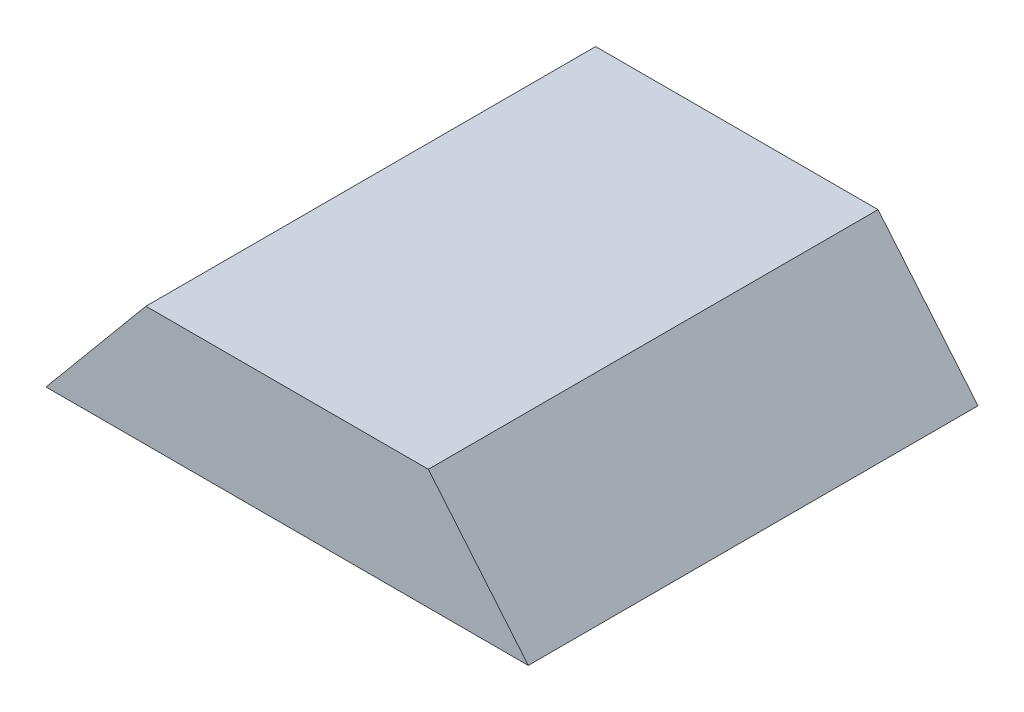
ISO-10303-21;
HEADER;
FILE_DESCRIPTION(('STEP AP214'),'2;1');
FILE_NAME('part.step','',(''),(''),'','','');
FILE_SCHEMA(('AUTOMOTIVE_DESIGN { 1 0 10303 214 1 1 1 1 }'));
ENDSEC;
DATA;
#1=APPLICATION_CONTEXT('core data for automotive mechanical design processes');
#2=APPLICATION_PROTOCOL_DEFINITION('international standard','automotive_design',2000,#1);
#3=PRODUCT_CONTEXT('',#1,'mechanical');
#4=PRODUCT('Part','Part','',(#3));
#5=PRODUCT_RELATED_PRODUCT_CATEGORY('part','',(#4));
#6=PRODUCT_DEFINITION_FORMATION('','',#4);
#7=PRODUCT_DEFINITION_CONTEXT('part definition',#1,'design');
#8=PRODUCT_DEFINITION('design','',#6,#7);
#9=PRODUCT_DEFINITION_SHAPE('','',#8);
#10=(LENGTH_UNIT() NAMED_UNIT(*) SI_UNIT(.MILLI.,.METRE.));
#11=(NAMED_UNIT(*) PLANE_ANGLE_UNIT() SI_UNIT($,.RADIAN.));
#12=(NAMED_UNIT(*) SI_UNIT($,.STERADIAN.) SOLID_ANGLE_UNIT());
#13=UNCERTAINTY_MEASURE_WITH_UNIT(LENGTH_MEASURE(1.E-05),#10,'distance_accuracy_value','');
#14=(GEOMETRIC_REPRESENTATION_CONTEXT(3) GLOBAL_UNCERTAINTY_ASSIGNED_CONTEXT((#13)) GLOBAL_UNIT_ASSIGNED_CONTEXT((#10,
#11,#12)) REPRESENTATION_CONTEXT('',''));
#15=CARTESIAN_POINT('',(0.,0.,0.));
#16=DIRECTION('',(0.,0.,1.));
#17=DIRECTION('',(1.,0.,0.));
#18=AXIS2_PLACEMENT_3D('',#15,#16,#17);
#19=CARTESIAN_POINT('',(-32.5,27.,104.));
#20=DIRECTION('',(-0.768221279597376,0.64018439966448,0.));
#21=DIRECTION('',(-0.64018439966448,-0.768221279597376,0.));
#22=AXIS2_PLACEMENT_3D('',#19,#20,#21);
#23=PLANE('',#22);
#24=DIRECTION('',(0.64018439966448,0.768221279597376,0.));
#25=VECTOR('',#24,1.);
#26=CARTESIAN_POINT('',(-32.5,27.,0.));
#27=LINE('',#26,#25);
#28=CARTESIAN_POINT('',(-55.,0.,0.));
#29=VERTEX_POINT('',#28);
#30=CARTESIAN_POINT('',(-32.5,27.,0.));
#31=VERTEX_POINT('',#30);
#32=EDGE_CURVE('E132',#29,#31,#27,.T.);
#33=ORIENTED_EDGE('',*,*,#32,.T.);
#34=DIRECTION('',(0.,0.,-1.));
#35=VECTOR('',#34,1.);
#36=CARTESIAN_POINT('',(-32.5,27.,104.));
#37=LINE('',#36,#35);
#38=CARTESIAN_POINT('',(-32.5,27.,104.));
#39=VERTEX_POINT('',#38);
#40=EDGE_CURVE('E11',#39,#31,#37,.T.);
#41=ORIENTED_EDGE('',*,*,#40,.F.);
#42=DIRECTION('',(0.64018439966448,0.768221279597376,0.));
#43=VECTOR('',#42,1.);
#44=CARTESIAN_POINT('',(-32.5,27.,104.));
#45=LINE('',#44,#43);
#46=CARTESIAN_POINT('',(-55.,0.,104.));
#47=VERTEX_POINT('',#46);
#48=EDGE_CURVE('E137',#47,#39,#45,.T.);
#49=ORIENTED_EDGE('',*,*,#48,.F.);
#50=DIRECTION('',(0.,0.,-1.));
#51=VECTOR('',#50,1.);
#52=CARTESIAN_POINT('',(-55.,0.,104.));
#53=LINE('',#52,#51);
#54=EDGE_CURVE('E51',#47,#29,#53,.T.);
#55=ORIENTED_EDGE('',*,*,#54,.T.);
#56=EDGE_LOOP('',(#33,#41,#49,#55));
#57=FACE_BOUND('',#56,.T.);
#58=ADVANCED_FACE('F33',(#57),#23,.F.);
#59=CARTESIAN_POINT('',(-32.5,27.,104.));
#60=DIRECTION('',(0.,1.,0.));
#61=DIRECTION('',(0.,0.,1.));
#62=AXIS2_PLACEMENT_3D('',#59,#60,#61);
#63=PLANE('',#62);
#64=DIRECTION('',(1.,0.,0.));
#65=VECTOR('',#64,1.);
#66=CARTESIAN_POINT('',(-32.5,27.,0.));
#67=LINE('',#66,#65);
#68=CARTESIAN_POINT('',(32.5,27.,0.));
#69=VERTEX_POINT('',#68);
#70=EDGE_CURVE('E179',#31,#69,#67,.T.);
#71=ORIENTED_EDGE('',*,*,#70,.T.);
#72=DIRECTION('',(0.,0.,-1.));
#73=VECTOR('',#72,1.);
#74=CARTESIAN_POINT('',(32.5,27.,104.));
#75=LINE('',#74,#73);
#76=CARTESIAN_POINT('',(32.5,27.,104.));
#77=VERTEX_POINT('',#76);
#78=EDGE_CURVE('E42',#77,#69,#75,.T.);
#79=ORIENTED_EDGE('',*,*,#78,.F.);
#80=DIRECTION('',(1.,0.,0.));
#81=VECTOR('',#80,1.);
#82=CARTESIAN_POINT('',(-32.5,27.,104.));
#83=LINE('',#82,#81);
#84=EDGE_CURVE('E89',#39,#77,#83,.T.);
#85=ORIENTED_EDGE('',*,*,#84,.F.);
#86=ORIENTED_EDGE('',*,*,#40,.T.);
#87=EDGE_LOOP('',(#71,#79,#85,#86));
#88=FACE_BOUND('',#87,.T.);
#89=ADVANCED_FACE('F185',(#88),#63,.F.);
#90=CARTESIAN_POINT('',(32.5,27.,104.));
#91=DIRECTION('',(0.768221279597376,0.64018439966448,0.));
#92=DIRECTION('',(-0.64018439966448,0.768221279597376,0.));
#93=AXIS2_PLACEMENT_3D('',#90,#91,#92);
#94=PLANE('',#93);
#95=DIRECTION('',(0.64018439966448,-0.768221279597376,0.));
#96=VECTOR('',#95,1.);
#97=CARTESIAN_POINT('',(32.5,27.,0.));
#98=LINE('',#97,#96);
#99=CARTESIAN_POINT('',(55.,0.,0.));
#100=VERTEX_POINT('',#99);
#101=EDGE_CURVE('E174',#69,#100,#98,.T.);
#102=ORIENTED_EDGE('',*,*,#101,.T.);
#103=DIRECTION('',(0.,0.,-1.));
#104=VECTOR('',#103,1.);
#105=CARTESIAN_POINT('',(55.,0.,104.));
#106=LINE('',#105,#104);
#107=CARTESIAN_POINT('',(55.,0.,104.));
#108=VERTEX_POINT('',#107);
#109=EDGE_CURVE('E162',#108,#100,#106,.T.);
#110=ORIENTED_EDGE('',*,*,#109,.F.);
#111=DIRECTION('',(0.64018439966448,-0.768221279597376,0.));
#112=VECTOR('',#111,1.);
#113=CARTESIAN_POINT('',(32.5,27.,104.));
#114=LINE('',#113,#112);
#115=EDGE_CURVE('E136',#77,#108,#114,.T.);
#116=ORIENTED_EDGE('',*,*,#115,.F.);
#117=ORIENTED_EDGE('',*,*,#78,.T.);
#118=EDGE_LOOP('',(#102,#110,#116,#117));
#119=FACE_BOUND('',#118,.T.);
#120=ADVANCED_FACE('F186',(#119),#94,.F.);
#121=CARTESIAN_POINT('',(56.3017082793178,0.,104.));
#122=DIRECTION('',(-0.768221279597376,-0.64018439966448,0.));
#123=DIRECTION('',(0.64018439966448,-0.768221279597376,0.));
#124=AXIS2_PLACEMENT_3D('',#121,#122,#123);
#125=PLANE('',#124);
#126=DIRECTION('',(-0.64018439966448,0.768221279597376,0.));
#127=VECTOR('',#126,1.);
#128=CARTESIAN_POINT('',(56.3017082793178,0.,0.));
#129=LINE('',#128,#127);
#130=CARTESIAN_POINT('',(56.3017082793178,0.,0.));
#131=VERTEX_POINT('',#130);
#132=CARTESIAN_POINT('',(32.9683749459845,28.,0.));
#133=VERTEX_POINT('',#132);
#134=EDGE_CURVE('E176',#131,#133,#129,.T.);
#135=ORIENTED_EDGE('',*,*,#134,.T.);
#136=DIRECTION('',(0.,0.,-1.));
#137=VECTOR('',#136,1.);
#138=CARTESIAN_POINT('',(32.9683749459845,28.,104.));
#139=LINE('',#138,#137);
#140=CARTESIAN_POINT('',(32.9683749459845,28.,105.));
#141=VERTEX_POINT('',#140);
#142=EDGE_CURVE('E158',#141,#133,#139,.T.);
#143=ORIENTED_EDGE('',*,*,#142,.F.);
#144=DIRECTION('',(-0.64018439966448,0.768221279597376,0.));
#145=VECTOR('',#144,1.);
#146=CARTESIAN_POINT('',(56.3017082793178,0.,105.));
#147=LINE('',#146,#145);
#148=CARTESIAN_POINT('',(56.3017082793178,0.,105.));
#149=VERTEX_POINT('',#148);
#150=EDGE_CURVE('E120',#149,#141,#147,.T.);
#151=ORIENTED_EDGE('',*,*,#150,.F.);
#152=DIRECTION('',(0.,0.,-1.));
#153=VECTOR('',#152,1.);
#154=CARTESIAN_POINT('',(56.3017082793178,0.,104.));
#155=LINE('',#154,#153);
#156=EDGE_CURVE('E116',#149,#131,#155,.T.);
#157=ORIENTED_EDGE('',*,*,#156,.T.);
#158=EDGE_LOOP('',(#135,#143,#151,#157));
#159=FACE_BOUND('',#158,.T.);
#160=ADVANCED_FACE('F202',(#159),#125,.F.);
#161=CARTESIAN_POINT('',(32.9683749459845,28.,104.));
#162=DIRECTION('',(0.,-1.,0.));
#163=DIRECTION('',(0.,0.,-1.));
#164=AXIS2_PLACEMENT_3D('',#161,#162,#163);
#165=PLANE('',#164);
#166=DIRECTION('',(-1.,0.,0.));
#167=VECTOR('',#166,1.);
#168=CARTESIAN_POINT('',(32.9683749459845,28.,0.));
#169=LINE('',#168,#167);
#170=CARTESIAN_POINT('',(-32.9683749459845,28.,0.));
#171=VERTEX_POINT('',#170);
#172=EDGE_CURVE('E153',#133,#171,#169,.T.);
#173=ORIENTED_EDGE('',*,*,#172,.T.);
#174=DIRECTION('',(0.,0.,-1.));
#175=VECTOR('',#174,1.);
#176=CARTESIAN_POINT('',(-32.9683749459845,28.,104.));
#177=LINE('',#176,#175);
#178=CARTESIAN_POINT('',(-32.9683749459845,28.,105.));
#179=VERTEX_POINT('',#178);
#180=EDGE_CURVE('E110',#179,#171,#177,.T.);
#181=ORIENTED_EDGE('',*,*,#180,.F.);
#182=DIRECTION('',(-1.,0.,0.));
#183=VECTOR('',#182,1.);
#184=CARTESIAN_POINT('',(32.9683749459845,28.,105.));
#185=LINE('',#184,#183);
#186=EDGE_CURVE('E125',#141,#179,#185,.T.);
#187=ORIENTED_EDGE('',*,*,#186,.F.);
#188=ORIENTED_EDGE('',*,*,#142,.T.);
#189=EDGE_LOOP('',(#173,#181,#187,#188));
#190=FACE_BOUND('',#189,.T.);
#191=ADVANCED_FACE('F182',(#190),#165,.F.);
#192=CARTESIAN_POINT('',(-56.3017082793178,0.,104.));
#193=DIRECTION('',(0.768221279597376,-0.64018439966448,0.));
#194=DIRECTION('',(0.64018439966448,0.768221279597376,0.));
#195=AXIS2_PLACEMENT_3D('',#192,#193,#194);
#196=PLANE('',#195);
#197=DIRECTION('',(-0.64018439966448,-0.768221279597376,0.));
#198=VECTOR('',#197,1.);
#199=CARTESIAN_POINT('',(-56.3017082793178,0.,0.));
#200=LINE('',#199,#198);
#201=CARTESIAN_POINT('',(-56.3017082793178,0.,0.));
#202=VERTEX_POINT('',#201);
#203=EDGE_CURVE('E82',#171,#202,#200,.T.);
#204=ORIENTED_EDGE('',*,*,#203,.T.);
#205=DIRECTION('',(0.,0.,-1.));
#206=VECTOR('',#205,1.);
#207=CARTESIAN_POINT('',(-56.3017082793178,0.,104.));
#208=LINE('',#207,#206);
#209=CARTESIAN_POINT('',(-56.3017082793178,0.,105.));
#210=VERTEX_POINT('',#209);
#211=EDGE_CURVE('E105',#210,#202,#208,.T.);
#212=ORIENTED_EDGE('',*,*,#211,.F.);
#213=DIRECTION('',(-0.64018439966448,-0.768221279597376,0.));
#214=VECTOR('',#213,1.);
#215=CARTESIAN_POINT('',(-32.9683749459845,28.,105.));
#216=LINE('',#215,#214);
#217=EDGE_CURVE('E109',#179,#210,#216,.T.);
#218=ORIENTED_EDGE('',*,*,#217,.F.);
#219=ORIENTED_EDGE('',*,*,#180,.T.);
#220=EDGE_LOOP('',(#204,#212,#218,#219));
#221=FACE_BOUND('',#220,.T.);
#222=ADVANCED_FACE('F107',(#221),#196,.F.);
#223=CARTESIAN_POINT('',(-55.,0.,104.));
#224=DIRECTION('',(0.,1.,0.));
#225=DIRECTION('',(-1.,0.,0.));
#226=AXIS2_PLACEMENT_3D('',#223,#224,#225);
#227=PLANE('',#226);
#228=DIRECTION('',(1.,0.,0.));
#229=VECTOR('',#228,1.);
#230=CARTESIAN_POINT('',(-55.,0.,0.));
#231=LINE('',#230,#229);
#232=EDGE_CURVE('E85',#202,#29,#231,.T.);
#233=ORIENTED_EDGE('',*,*,#232,.T.);
#234=ORIENTED_EDGE('',*,*,#54,.F.);
#235=DIRECTION('',(1.,0.,0.));
#236=VECTOR('',#235,1.);
#237=CARTESIAN_POINT('',(-56.3017082793178,0.,104.));
#238=LINE('',#237,#236);
#239=EDGE_CURVE('E126',#47,#108,#238,.T.);
#240=ORIENTED_EDGE('',*,*,#239,.T.);
#241=ORIENTED_EDGE('',*,*,#109,.T.);
#242=DIRECTION('',(1.,0.,0.));
#243=VECTOR('',#242,1.);
#244=CARTESIAN_POINT('',(55.,0.,0.));
#245=LINE('',#244,#243);
#246=EDGE_CURVE('E166',#100,#131,#245,.T.);
#247=ORIENTED_EDGE('',*,*,#246,.T.);
#248=ORIENTED_EDGE('',*,*,#156,.F.);
#249=DIRECTION('',(1.,0.,0.));
#250=VECTOR('',#249,1.);
#251=CARTESIAN_POINT('',(-56.3017082793178,0.,105.));
#252=LINE('',#251,#250);
#253=EDGE_CURVE('E113',#210,#149,#252,.T.);
#254=ORIENTED_EDGE('',*,*,#253,.F.);
#255=ORIENTED_EDGE('',*,*,#211,.T.);
#256=EDGE_LOOP('',(#233,#234,#240,#241,#247,#248,#254,#255));
#257=FACE_BOUND('',#256,.T.);
#258=ADVANCED_FACE('F114',(#257),#227,.F.);
#259=CARTESIAN_POINT('',(0.,0.,0.));
#260=DIRECTION('',(0.,0.,-1.));
#261=DIRECTION('',(-1.,0.,0.));
#262=AXIS2_PLACEMENT_3D('',#259,#260,#261);
#263=PLANE('',#262);
#264=ORIENTED_EDGE('',*,*,#32,.F.);
#265=ORIENTED_EDGE('',*,*,#232,.F.);
#266=ORIENTED_EDGE('',*,*,#203,.F.);
#267=ORIENTED_EDGE('',*,*,#172,.F.);
#268=ORIENTED_EDGE('',*,*,#134,.F.);
#269=ORIENTED_EDGE('',*,*,#246,.F.);
#270=ORIENTED_EDGE('',*,*,#101,.F.);
#271=ORIENTED_EDGE('',*,*,#70,.F.);
#272=EDGE_LOOP('',(#264,#265,#266,#267,#268,#269,#270,#271));
#273=FACE_BOUND('',#272,.T.);
#274=ADVANCED_FACE('F173',(#273),#263,.T.);
#275=CARTESIAN_POINT('',(0.,0.,105.));
#276=DIRECTION('',(0.,0.,-1.));
#277=DIRECTION('',(-1.,0.,0.));
#278=AXIS2_PLACEMENT_3D('',#275,#276,#277);
#279=PLANE('',#278);
#280=ORIENTED_EDGE('',*,*,#217,.T.);
#281=ORIENTED_EDGE('',*,*,#253,.T.);
#282=ORIENTED_EDGE('',*,*,#150,.T.);
#283=ORIENTED_EDGE('',*,*,#186,.T.);
#284=EDGE_LOOP('',(#280,#281,#282,#283));
#285=FACE_BOUND('',#284,.T.);
#286=ADVANCED_FACE('F123',(#285),#279,.F.);
#287=CARTESIAN_POINT('',(0.,0.,104.));
#288=DIRECTION('',(0.,0.,-1.));
#289=DIRECTION('',(-1.,0.,0.));
#290=AXIS2_PLACEMENT_3D('',#287,#288,#289);
#291=PLANE('',#290);
#292=ORIENTED_EDGE('',*,*,#239,.F.);
#293=ORIENTED_EDGE('',*,*,#48,.T.);
#294=ORIENTED_EDGE('',*,*,#84,.T.);
#295=ORIENTED_EDGE('',*,*,#115,.T.);
#296=EDGE_LOOP('',(#292,#293,#294,#295));
#297=FACE_BOUND('',#296,.T.);
#298=ADVANCED_FACE('F187',(#297),#291,.T.);
#299=CLOSED_SHELL('',(#58,#89,#120,#160,#191,#222,#258,#274,#286,#298));
#300=MANIFOLD_SOLID_BREP('B2',#299);
#301=ADVANCED_BREP_SHAPE_REPRESENTATION('',(#18,#300),#14);
#302=SHAPE_DEFINITION_REPRESENTATION(#9,#301);
ENDSEC;
END-ISO-10303-21;
